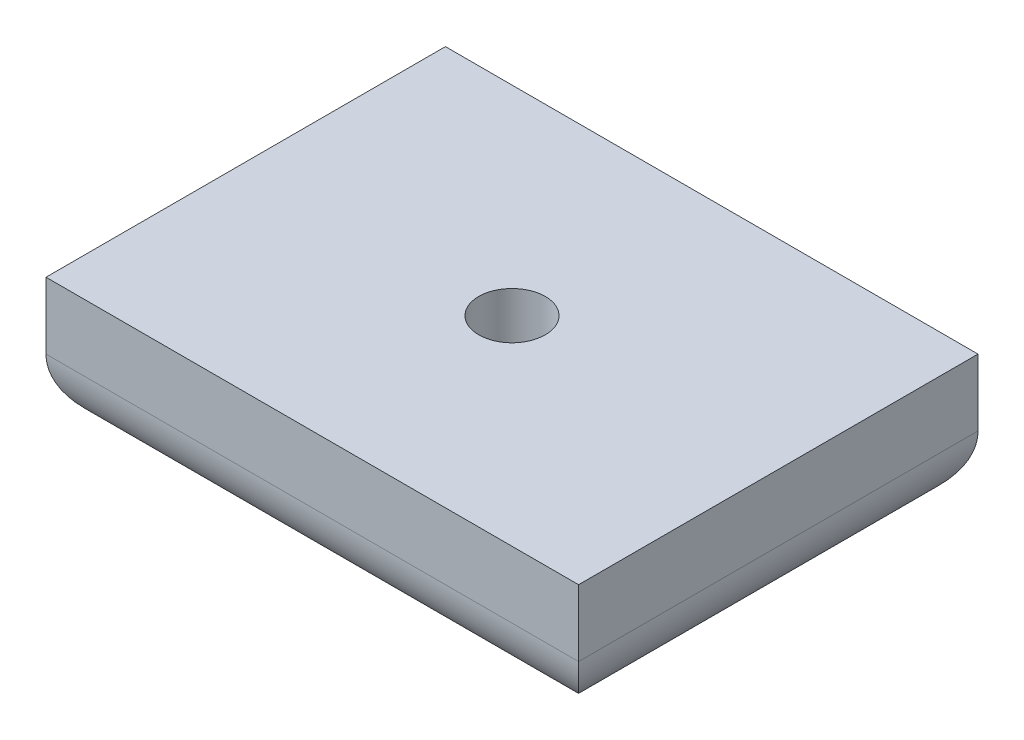
ISO-10303-21;
HEADER;
FILE_DESCRIPTION(('STEP AP214'),'2;1');
FILE_NAME('part.step','',(''),(''),'','','');
FILE_SCHEMA(('AUTOMOTIVE_DESIGN { 1 0 10303 214 1 1 1 1 }'));
ENDSEC;
DATA;
#1=APPLICATION_CONTEXT('core data for automotive mechanical design processes');
#2=APPLICATION_PROTOCOL_DEFINITION('international standard','automotive_design',2000,#1);
#3=PRODUCT_CONTEXT('',#1,'mechanical');
#4=PRODUCT('Part','Part','',(#3));
#5=PRODUCT_RELATED_PRODUCT_CATEGORY('part','',(#4));
#6=PRODUCT_DEFINITION_FORMATION('','',#4);
#7=PRODUCT_DEFINITION_CONTEXT('part definition',#1,'design');
#8=PRODUCT_DEFINITION('design','',#6,#7);
#9=PRODUCT_DEFINITION_SHAPE('','',#8);
#10=(LENGTH_UNIT() NAMED_UNIT(*) SI_UNIT(.MILLI.,.METRE.));
#11=(NAMED_UNIT(*) PLANE_ANGLE_UNIT() SI_UNIT($,.RADIAN.));
#12=(NAMED_UNIT(*) SI_UNIT($,.STERADIAN.) SOLID_ANGLE_UNIT());
#13=UNCERTAINTY_MEASURE_WITH_UNIT(LENGTH_MEASURE(1.E-05),#10,'distance_accuracy_value','');
#14=(GEOMETRIC_REPRESENTATION_CONTEXT(3) GLOBAL_UNCERTAINTY_ASSIGNED_CONTEXT((#13)) GLOBAL_UNIT_ASSIGNED_CONTEXT((#10,
#11,#12)) REPRESENTATION_CONTEXT('',''));
#15=CARTESIAN_POINT('',(0.,0.,0.));
#16=DIRECTION('',(0.,0.,1.));
#17=DIRECTION('',(1.,0.,0.));
#18=AXIS2_PLACEMENT_3D('',#15,#16,#17);
#19=CARTESIAN_POINT('',(0.,10.,0.));
#20=DIRECTION('',(0.,-1.,0.));
#21=DIRECTION('',(0.,0.,-1.));
#22=AXIS2_PLACEMENT_3D('',#19,#20,#21);
#23=CYLINDRICAL_SURFACE('',#22,2.5);
#24=CARTESIAN_POINT('',(0.,10.,0.));
#25=DIRECTION('',(0.,1.,0.));
#26=DIRECTION('',(0.,0.,1.));
#27=AXIS2_PLACEMENT_3D('',#24,#25,#26);
#28=CIRCLE('',#27,2.5);
#29=CARTESIAN_POINT('',(0.,10.,2.5));
#30=VERTEX_POINT('',#29);
#31=EDGE_CURVE('E104',#30,#30,#28,.T.);
#32=ORIENTED_EDGE('',*,*,#31,.T.);
#33=EDGE_LOOP('',(#32));
#34=FACE_BOUND('',#33,.T.);
#35=CARTESIAN_POINT('',(0.,5.,0.));
#36=DIRECTION('',(0.,-1.,0.));
#37=DIRECTION('',(0.,0.,-1.));
#38=AXIS2_PLACEMENT_3D('',#35,#36,#37);
#39=CIRCLE('',#38,2.5);
#40=CARTESIAN_POINT('',(0.,5.,-2.5));
#41=VERTEX_POINT('',#40);
#42=EDGE_CURVE('E37',#41,#41,#39,.T.);
#43=ORIENTED_EDGE('',*,*,#42,.T.);
#44=EDGE_LOOP('',(#43));
#45=FACE_BOUND('',#44,.T.);
#46=ADVANCED_FACE('F33',(#34,#45),#23,.F.);
#47=CARTESIAN_POINT('',(0.,10.,0.));
#48=DIRECTION('',(0.,-1.,0.));
#49=DIRECTION('',(0.,0.,-1.));
#50=AXIS2_PLACEMENT_3D('',#47,#48,#49);
#51=PLANE('',#50);
#52=DIRECTION('',(0.,0.,1.));
#53=VECTOR('',#52,1.);
#54=CARTESIAN_POINT('',(-20.,10.,-15.));
#55=LINE('',#54,#53);
#56=CARTESIAN_POINT('',(-20.,10.,-15.));
#57=VERTEX_POINT('',#56);
#58=CARTESIAN_POINT('',(-20.,10.,15.));
#59=VERTEX_POINT('',#58);
#60=EDGE_CURVE('E94',#57,#59,#55,.T.);
#61=ORIENTED_EDGE('',*,*,#60,.T.);
#62=DIRECTION('',(1.,0.,0.));
#63=VECTOR('',#62,1.);
#64=CARTESIAN_POINT('',(20.,10.,15.));
#65=LINE('',#64,#63);
#66=CARTESIAN_POINT('',(20.,10.,15.));
#67=VERTEX_POINT('',#66);
#68=EDGE_CURVE('E85',#59,#67,#65,.T.);
#69=ORIENTED_EDGE('',*,*,#68,.T.);
#70=DIRECTION('',(0.,0.,-1.));
#71=VECTOR('',#70,1.);
#72=CARTESIAN_POINT('',(20.,10.,-15.));
#73=LINE('',#72,#71);
#74=CARTESIAN_POINT('',(20.,10.,-15.));
#75=VERTEX_POINT('',#74);
#76=EDGE_CURVE('E93',#67,#75,#73,.T.);
#77=ORIENTED_EDGE('',*,*,#76,.T.);
#78=DIRECTION('',(-1.,0.,0.));
#79=VECTOR('',#78,1.);
#80=CARTESIAN_POINT('',(20.,10.,-15.));
#81=LINE('',#80,#79);
#82=EDGE_CURVE('E100',#75,#57,#81,.T.);
#83=ORIENTED_EDGE('',*,*,#82,.T.);
#84=EDGE_LOOP('',(#61,#69,#77,#83));
#85=FACE_BOUND('',#84,.T.);
#86=ORIENTED_EDGE('',*,*,#31,.F.);
#87=EDGE_LOOP('',(#86));
#88=FACE_BOUND('',#87,.T.);
#89=ADVANCED_FACE('F97',(#85,#88),#51,.F.);
#90=CARTESIAN_POINT('',(0.,0.,0.));
#91=DIRECTION('',(0.,-1.,0.));
#92=DIRECTION('',(0.,0.,-1.));
#93=AXIS2_PLACEMENT_3D('',#90,#91,#92);
#94=PLANE('',#93);
#95=CARTESIAN_POINT('',(0.,0.,0.));
#96=DIRECTION('',(0.,-1.,0.));
#97=DIRECTION('',(0.,0.,-1.));
#98=AXIS2_PLACEMENT_3D('',#95,#96,#97);
#99=CIRCLE('',#98,4.);
#100=CARTESIAN_POINT('',(0.,0.,-4.));
#101=VERTEX_POINT('',#100);
#102=EDGE_CURVE('E145',#101,#101,#99,.T.);
#103=ORIENTED_EDGE('',*,*,#102,.F.);
#104=EDGE_LOOP('',(#103));
#105=FACE_BOUND('',#104,.T.);
#106=DIRECTION('',(1.,0.,0.));
#107=VECTOR('',#106,1.);
#108=CARTESIAN_POINT('',(-20.,0.,10.));
#109=LINE('',#108,#107);
#110=CARTESIAN_POINT('',(15.,0.,10.));
#111=VERTEX_POINT('',#110);
#112=CARTESIAN_POINT('',(-15.,0.,10.));
#113=VERTEX_POINT('',#112);
#114=EDGE_CURVE('E111',#111,#113,#109,.F.);
#115=ORIENTED_EDGE('',*,*,#114,.T.);
#116=DIRECTION('',(0.,0.,1.));
#117=VECTOR('',#116,1.);
#118=CARTESIAN_POINT('',(-15.,0.,-15.));
#119=LINE('',#118,#117);
#120=CARTESIAN_POINT('',(-15.,0.,-10.));
#121=VERTEX_POINT('',#120);
#122=EDGE_CURVE('E122',#113,#121,#119,.F.);
#123=ORIENTED_EDGE('',*,*,#122,.T.);
#124=DIRECTION('',(-1.,0.,0.));
#125=VECTOR('',#124,1.);
#126=CARTESIAN_POINT('',(20.,0.,-10.));
#127=LINE('',#126,#125);
#128=CARTESIAN_POINT('',(15.,0.,-10.));
#129=VERTEX_POINT('',#128);
#130=EDGE_CURVE('E120',#121,#129,#127,.F.);
#131=ORIENTED_EDGE('',*,*,#130,.T.);
#132=DIRECTION('',(0.,0.,-1.));
#133=VECTOR('',#132,1.);
#134=CARTESIAN_POINT('',(15.,0.,15.));
#135=LINE('',#134,#133);
#136=EDGE_CURVE('E118',#129,#111,#135,.F.);
#137=ORIENTED_EDGE('',*,*,#136,.T.);
#138=EDGE_LOOP('',(#115,#123,#131,#137));
#139=FACE_BOUND('',#138,.T.);
#140=ADVANCED_FACE('F166',(#105,#139),#94,.T.);
#141=CARTESIAN_POINT('',(-20.,10.,-15.));
#142=DIRECTION('',(1.,0.,0.));
#143=DIRECTION('',(0.,0.,-1.));
#144=AXIS2_PLACEMENT_3D('',#141,#142,#143);
#145=PLANE('',#144);
#146=DIRECTION('',(0.,-1.,0.));
#147=VECTOR('',#146,1.);
#148=CARTESIAN_POINT('',(-20.,10.,-15.));
#149=LINE('',#148,#147);
#150=CARTESIAN_POINT('',(-20.,5.,-15.));
#151=VERTEX_POINT('',#150);
#152=EDGE_CURVE('E150',#57,#151,#149,.T.);
#153=ORIENTED_EDGE('',*,*,#152,.T.);
#154=DIRECTION('',(0.,0.,1.));
#155=VECTOR('',#154,1.);
#156=CARTESIAN_POINT('',(-20.,5.,15.));
#157=LINE('',#156,#155);
#158=CARTESIAN_POINT('',(-20.,5.,15.));
#159=VERTEX_POINT('',#158);
#160=EDGE_CURVE('E109',#151,#159,#157,.T.);
#161=ORIENTED_EDGE('',*,*,#160,.T.);
#162=DIRECTION('',(0.,-1.,0.));
#163=VECTOR('',#162,1.);
#164=CARTESIAN_POINT('',(-20.,10.,15.));
#165=LINE('',#164,#163);
#166=EDGE_CURVE('E89',#59,#159,#165,.T.);
#167=ORIENTED_EDGE('',*,*,#166,.F.);
#168=ORIENTED_EDGE('',*,*,#60,.F.);
#169=EDGE_LOOP('',(#153,#161,#167,#168));
#170=FACE_BOUND('',#169,.T.);
#171=ADVANCED_FACE('F107',(#170),#145,.F.);
#172=CARTESIAN_POINT('',(20.,10.,15.));
#173=DIRECTION('',(0.,0.,-1.));
#174=DIRECTION('',(-1.,0.,0.));
#175=AXIS2_PLACEMENT_3D('',#172,#173,#174);
#176=PLANE('',#175);
#177=ORIENTED_EDGE('',*,*,#166,.T.);
#178=DIRECTION('',(1.,0.,0.));
#179=VECTOR('',#178,1.);
#180=CARTESIAN_POINT('',(20.,5.,15.));
#181=LINE('',#180,#179);
#182=CARTESIAN_POINT('',(20.,5.,15.));
#183=VERTEX_POINT('',#182);
#184=EDGE_CURVE('E11',#159,#183,#181,.T.);
#185=ORIENTED_EDGE('',*,*,#184,.T.);
#186=DIRECTION('',(0.,-1.,0.));
#187=VECTOR('',#186,1.);
#188=CARTESIAN_POINT('',(20.,10.,15.));
#189=LINE('',#188,#187);
#190=EDGE_CURVE('E90',#67,#183,#189,.T.);
#191=ORIENTED_EDGE('',*,*,#190,.F.);
#192=ORIENTED_EDGE('',*,*,#68,.F.);
#193=EDGE_LOOP('',(#177,#185,#191,#192));
#194=FACE_BOUND('',#193,.T.);
#195=ADVANCED_FACE('F87',(#194),#176,.F.);
#196=CARTESIAN_POINT('',(20.,10.,-15.));
#197=DIRECTION('',(-1.,0.,0.));
#198=DIRECTION('',(0.,0.,1.));
#199=AXIS2_PLACEMENT_3D('',#196,#197,#198);
#200=PLANE('',#199);
#201=ORIENTED_EDGE('',*,*,#190,.T.);
#202=DIRECTION('',(0.,0.,-1.));
#203=VECTOR('',#202,1.);
#204=CARTESIAN_POINT('',(20.,5.,-15.));
#205=LINE('',#204,#203);
#206=CARTESIAN_POINT('',(20.,5.,-15.));
#207=VERTEX_POINT('',#206);
#208=EDGE_CURVE('E42',#183,#207,#205,.T.);
#209=ORIENTED_EDGE('',*,*,#208,.T.);
#210=DIRECTION('',(0.,-1.,0.));
#211=VECTOR('',#210,1.);
#212=CARTESIAN_POINT('',(20.,10.,-15.));
#213=LINE('',#212,#211);
#214=EDGE_CURVE('E113',#75,#207,#213,.T.);
#215=ORIENTED_EDGE('',*,*,#214,.F.);
#216=ORIENTED_EDGE('',*,*,#76,.F.);
#217=EDGE_LOOP('',(#201,#209,#215,#216));
#218=FACE_BOUND('',#217,.T.);
#219=ADVANCED_FACE('F233',(#218),#200,.F.);
#220=CARTESIAN_POINT('',(20.,10.,-15.));
#221=DIRECTION('',(0.,0.,1.));
#222=DIRECTION('',(1.,0.,0.));
#223=AXIS2_PLACEMENT_3D('',#220,#221,#222);
#224=PLANE('',#223);
#225=ORIENTED_EDGE('',*,*,#214,.T.);
#226=DIRECTION('',(-1.,0.,0.));
#227=VECTOR('',#226,1.);
#228=CARTESIAN_POINT('',(-20.,5.,-15.));
#229=LINE('',#228,#227);
#230=EDGE_CURVE('E125',#207,#151,#229,.T.);
#231=ORIENTED_EDGE('',*,*,#230,.T.);
#232=ORIENTED_EDGE('',*,*,#152,.F.);
#233=ORIENTED_EDGE('',*,*,#82,.F.);
#234=EDGE_LOOP('',(#225,#231,#232,#233));
#235=FACE_BOUND('',#234,.T.);
#236=ADVANCED_FACE('F152',(#235),#224,.F.);
#237=CARTESIAN_POINT('',(15.,5.,-15.));
#238=DIRECTION('',(0.,0.,1.));
#239=DIRECTION('',(1.,0.,0.));
#240=AXIS2_PLACEMENT_3D('',#237,#238,#239);
#241=CYLINDRICAL_SURFACE('',#240,5.);
#242=CARTESIAN_POINT('',(15.,5.,10.));
#243=DIRECTION('',(-0.707106781186547,0.,0.707106781186548));
#244=DIRECTION('',(-0.707106781186548,0.,-0.707106781186547));
#245=AXIS2_PLACEMENT_3D('',#242,#243,#244);
#246=ELLIPSE('',#245,7.07106781186548,5.);
#247=EDGE_CURVE('E132',#111,#183,#246,.T.);
#248=ORIENTED_EDGE('',*,*,#247,.F.);
#249=ORIENTED_EDGE('',*,*,#136,.F.);
#250=CARTESIAN_POINT('',(15.,5.,-10.));
#251=DIRECTION('',(0.707106781186548,0.,0.707106781186547));
#252=DIRECTION('',(-0.707106781186547,0.,0.707106781186548));
#253=AXIS2_PLACEMENT_3D('',#250,#251,#252);
#254=ELLIPSE('',#253,7.07106781186547,5.);
#255=EDGE_CURVE('E134',#207,#129,#254,.F.);
#256=ORIENTED_EDGE('',*,*,#255,.F.);
#257=ORIENTED_EDGE('',*,*,#208,.F.);
#258=EDGE_LOOP('',(#248,#249,#256,#257));
#259=FACE_BOUND('',#258,.T.);
#260=ADVANCED_FACE('F35',(#259),#241,.T.);
#261=CARTESIAN_POINT('',(20.,5.,-10.));
#262=DIRECTION('',(1.,0.,0.));
#263=DIRECTION('',(0.,0.,-1.));
#264=AXIS2_PLACEMENT_3D('',#261,#262,#263);
#265=CYLINDRICAL_SURFACE('',#264,5.);
#266=ORIENTED_EDGE('',*,*,#255,.T.);
#267=ORIENTED_EDGE('',*,*,#130,.F.);
#268=CARTESIAN_POINT('',(-15.,5.,-10.));
#269=DIRECTION('',(0.707106781186547,0.,-0.707106781186548));
#270=DIRECTION('',(0.707106781186548,0.,0.707106781186547));
#271=AXIS2_PLACEMENT_3D('',#268,#269,#270);
#272=ELLIPSE('',#271,7.07106781186548,5.);
#273=EDGE_CURVE('E130',#151,#121,#272,.F.);
#274=ORIENTED_EDGE('',*,*,#273,.F.);
#275=ORIENTED_EDGE('',*,*,#230,.F.);
#276=EDGE_LOOP('',(#266,#267,#274,#275));
#277=FACE_BOUND('',#276,.T.);
#278=ADVANCED_FACE('F157',(#277),#265,.T.);
#279=CARTESIAN_POINT('',(20.,5.,10.));
#280=DIRECTION('',(-1.,0.,0.));
#281=DIRECTION('',(0.,0.,1.));
#282=AXIS2_PLACEMENT_3D('',#279,#280,#281);
#283=CYLINDRICAL_SURFACE('',#282,5.);
#284=ORIENTED_EDGE('',*,*,#247,.T.);
#285=ORIENTED_EDGE('',*,*,#184,.F.);
#286=CARTESIAN_POINT('',(-15.,5.,10.));
#287=DIRECTION('',(-0.707106781186548,0.,-0.707106781186547));
#288=DIRECTION('',(-0.707106781186547,0.,0.707106781186548));
#289=AXIS2_PLACEMENT_3D('',#286,#287,#288);
#290=ELLIPSE('',#289,7.07106781186547,5.);
#291=EDGE_CURVE('E128',#113,#159,#290,.T.);
#292=ORIENTED_EDGE('',*,*,#291,.F.);
#293=ORIENTED_EDGE('',*,*,#114,.F.);
#294=EDGE_LOOP('',(#284,#285,#292,#293));
#295=FACE_BOUND('',#294,.T.);
#296=ADVANCED_FACE('F164',(#295),#283,.T.);
#297=CARTESIAN_POINT('',(-15.,5.,-15.));
#298=DIRECTION('',(0.,0.,-1.));
#299=DIRECTION('',(-1.,0.,0.));
#300=AXIS2_PLACEMENT_3D('',#297,#298,#299);
#301=CYLINDRICAL_SURFACE('',#300,5.);
#302=ORIENTED_EDGE('',*,*,#273,.T.);
#303=ORIENTED_EDGE('',*,*,#122,.F.);
#304=ORIENTED_EDGE('',*,*,#291,.T.);
#305=ORIENTED_EDGE('',*,*,#160,.F.);
#306=EDGE_LOOP('',(#302,#303,#304,#305));
#307=FACE_BOUND('',#306,.T.);
#308=ADVANCED_FACE('F160',(#307),#301,.T.);
#309=CARTESIAN_POINT('',(0.,5.,0.));
#310=DIRECTION('',(0.,-1.,0.));
#311=DIRECTION('',(0.,0.,-1.));
#312=AXIS2_PLACEMENT_3D('',#309,#310,#311);
#313=CYLINDRICAL_SURFACE('',#312,4.);
#314=CARTESIAN_POINT('',(0.,5.,0.));
#315=DIRECTION('',(0.,-1.,0.));
#316=DIRECTION('',(0.,0.,-1.));
#317=AXIS2_PLACEMENT_3D('',#314,#315,#316);
#318=CIRCLE('',#317,4.);
#319=CARTESIAN_POINT('',(0.,5.,-4.));
#320=VERTEX_POINT('',#319);
#321=EDGE_CURVE('E198',#320,#320,#318,.T.);
#322=ORIENTED_EDGE('',*,*,#321,.F.);
#323=EDGE_LOOP('',(#322));
#324=FACE_BOUND('',#323,.T.);
#325=ORIENTED_EDGE('',*,*,#102,.T.);
#326=EDGE_LOOP('',(#325));
#327=FACE_BOUND('',#326,.T.);
#328=ADVANCED_FACE('F184',(#324,#327),#313,.F.);
#329=CARTESIAN_POINT('',(0.,5.,0.));
#330=DIRECTION('',(0.,-1.,0.));
#331=DIRECTION('',(0.,0.,-1.));
#332=AXIS2_PLACEMENT_3D('',#329,#330,#331);
#333=PLANE('',#332);
#334=ORIENTED_EDGE('',*,*,#42,.F.);
#335=EDGE_LOOP('',(#334));
#336=FACE_BOUND('',#335,.T.);
#337=ORIENTED_EDGE('',*,*,#321,.T.);
#338=EDGE_LOOP('',(#337));
#339=FACE_BOUND('',#338,.T.);
#340=ADVANCED_FACE('F187',(#336,#339),#333,.T.);
#341=CLOSED_SHELL('',(#46,#89,#140,#171,#195,#219,#236,#260,#278,#296,#308,#328,#340));
#342=MANIFOLD_SOLID_BREP('B2',#341);
#343=ADVANCED_BREP_SHAPE_REPRESENTATION('',(#18,#342),#14);
#344=SHAPE_DEFINITION_REPRESENTATION(#9,#343);
ENDSEC;
END-ISO-10303-21;
